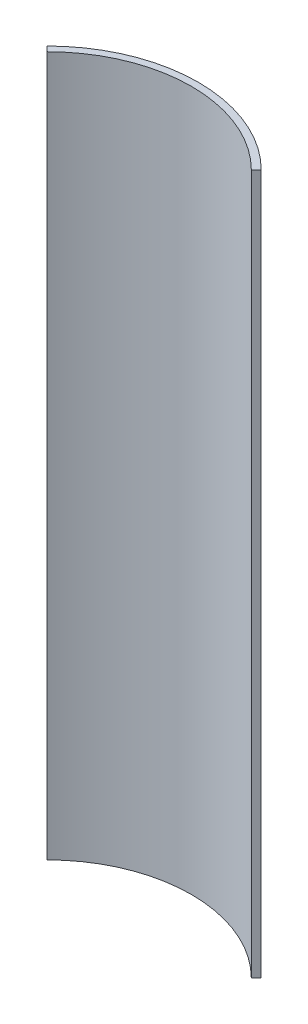
ISO-10303-21;
HEADER;
FILE_DESCRIPTION(('STEP AP214'),'2;1');
FILE_NAME('part.step','',(''),(''),'','','');
FILE_SCHEMA(('AUTOMOTIVE_DESIGN { 1 0 10303 214 1 1 1 1 }'));
ENDSEC;
DATA;
#1=APPLICATION_CONTEXT('core data for automotive mechanical design processes');
#2=APPLICATION_PROTOCOL_DEFINITION('international standard','automotive_design',2000,#1);
#3=PRODUCT_CONTEXT('',#1,'mechanical');
#4=PRODUCT('Part','Part','',(#3));
#5=PRODUCT_RELATED_PRODUCT_CATEGORY('part','',(#4));
#6=PRODUCT_DEFINITION_FORMATION('','',#4);
#7=PRODUCT_DEFINITION_CONTEXT('part definition',#1,'design');
#8=PRODUCT_DEFINITION('design','',#6,#7);
#9=PRODUCT_DEFINITION_SHAPE('','',#8);
#10=(LENGTH_UNIT() NAMED_UNIT(*) SI_UNIT(.MILLI.,.METRE.));
#11=(NAMED_UNIT(*) PLANE_ANGLE_UNIT() SI_UNIT($,.RADIAN.));
#12=(NAMED_UNIT(*) SI_UNIT($,.STERADIAN.) SOLID_ANGLE_UNIT());
#13=UNCERTAINTY_MEASURE_WITH_UNIT(LENGTH_MEASURE(1.E-05),#10,'distance_accuracy_value','');
#14=(GEOMETRIC_REPRESENTATION_CONTEXT(3) GLOBAL_UNCERTAINTY_ASSIGNED_CONTEXT((#13)) GLOBAL_UNIT_ASSIGNED_CONTEXT((#10,
#11,#12)) REPRESENTATION_CONTEXT('',''));
#15=CARTESIAN_POINT('',(0.,0.,0.));
#16=DIRECTION('',(0.,0.,1.));
#17=DIRECTION('',(1.,0.,0.));
#18=AXIS2_PLACEMENT_3D('',#15,#16,#17);
#19=CARTESIAN_POINT('',(0.,0.,0.));
#20=DIRECTION('',(0.,-1.,0.));
#21=DIRECTION('',(0.,0.,-1.));
#22=AXIS2_PLACEMENT_3D('',#19,#20,#21);
#23=CYLINDRICAL_SURFACE('',#22,62.);
#24=CARTESIAN_POINT('',(0.,-150.,0.));
#25=DIRECTION('',(0.,-1.,0.));
#26=DIRECTION('',(0.,0.,-1.));
#27=AXIS2_PLACEMENT_3D('',#24,#25,#26);
#28=CIRCLE('',#27,62.);
#29=CARTESIAN_POINT('',(-43.840620433566,-150.,-43.840620433566));
#30=VERTEX_POINT('',#29);
#31=CARTESIAN_POINT('',(43.840620433566,-150.,-43.840620433566));
#32=VERTEX_POINT('',#31);
#33=EDGE_CURVE('E49',#30,#32,#28,.T.);
#34=ORIENTED_EDGE('',*,*,#33,.T.);
#35=DIRECTION('',(0.,-1.,0.));
#36=VECTOR('',#35,1.);
#37=CARTESIAN_POINT('',(43.840620433566,0.,-43.840620433566));
#38=LINE('',#37,#36);
#39=CARTESIAN_POINT('',(43.840620433566,150.,-43.840620433566));
#40=VERTEX_POINT('',#39);
#41=EDGE_CURVE('E106',#32,#40,#38,.F.);
#42=ORIENTED_EDGE('',*,*,#41,.T.);
#43=CARTESIAN_POINT('',(0.,150.,0.));
#44=DIRECTION('',(0.,-1.,0.));
#45=DIRECTION('',(0.,0.,-1.));
#46=AXIS2_PLACEMENT_3D('',#43,#44,#45);
#47=CIRCLE('',#46,62.);
#48=CARTESIAN_POINT('',(-43.840620433566,150.,-43.840620433566));
#49=VERTEX_POINT('',#48);
#50=EDGE_CURVE('E101',#49,#40,#47,.T.);
#51=ORIENTED_EDGE('',*,*,#50,.F.);
#52=DIRECTION('',(0.,-1.,0.));
#53=VECTOR('',#52,1.);
#54=CARTESIAN_POINT('',(-43.840620433566,0.,-43.840620433566));
#55=LINE('',#54,#53);
#56=EDGE_CURVE('E63',#49,#30,#55,.T.);
#57=ORIENTED_EDGE('',*,*,#56,.T.);
#58=EDGE_LOOP('',(#34,#42,#51,#57));
#59=FACE_BOUND('',#58,.T.);
#60=ADVANCED_FACE('F42',(#59),#23,.F.);
#61=CARTESIAN_POINT('',(62.,-150.,0.));
#62=DIRECTION('',(0.,-1.,0.));
#63=DIRECTION('',(0.,0.,-1.));
#64=AXIS2_PLACEMENT_3D('',#61,#62,#63);
#65=PLANE('',#64);
#66=CARTESIAN_POINT('',(0.,-150.,0.));
#67=DIRECTION('',(0.,-1.,0.));
#68=DIRECTION('',(0.,0.,-1.));
#69=AXIS2_PLACEMENT_3D('',#66,#67,#68);
#70=CIRCLE('',#69,65.);
#71=CARTESIAN_POINT('',(-45.9619407771256,-150.,-45.9619407771256));
#72=VERTEX_POINT('',#71);
#73=CARTESIAN_POINT('',(45.9619407771256,-150.,-45.9619407771256));
#74=VERTEX_POINT('',#73);
#75=EDGE_CURVE('E95',#72,#74,#70,.T.);
#76=ORIENTED_EDGE('',*,*,#75,.T.);
#77=DIRECTION('',(0.707106781186548,0.,-0.707106781186548));
#78=VECTOR('',#77,1.);
#79=CARTESIAN_POINT('',(0.,-150.,0.));
#80=LINE('',#79,#78);
#81=EDGE_CURVE('E88',#32,#74,#80,.T.);
#82=ORIENTED_EDGE('',*,*,#81,.F.);
#83=ORIENTED_EDGE('',*,*,#33,.F.);
#84=DIRECTION('',(0.707106781186548,0.,0.707106781186548));
#85=VECTOR('',#84,1.);
#86=CARTESIAN_POINT('',(0.,-150.,0.));
#87=LINE('',#86,#85);
#88=EDGE_CURVE('E82',#72,#30,#87,.T.);
#89=ORIENTED_EDGE('',*,*,#88,.F.);
#90=EDGE_LOOP('',(#76,#82,#83,#89));
#91=FACE_BOUND('',#90,.T.);
#92=ADVANCED_FACE('F93',(#91),#65,.T.);
#93=CARTESIAN_POINT('',(0.,0.,0.));
#94=DIRECTION('',(0.,-1.,0.));
#95=DIRECTION('',(0.,0.,-1.));
#96=AXIS2_PLACEMENT_3D('',#93,#94,#95);
#97=CYLINDRICAL_SURFACE('',#96,65.);
#98=CARTESIAN_POINT('',(0.,150.,0.));
#99=DIRECTION('',(0.,-1.,0.));
#100=DIRECTION('',(0.,0.,-1.));
#101=AXIS2_PLACEMENT_3D('',#98,#99,#100);
#102=CIRCLE('',#101,65.);
#103=CARTESIAN_POINT('',(-45.9619407771256,150.,-45.9619407771256));
#104=VERTEX_POINT('',#103);
#105=CARTESIAN_POINT('',(45.9619407771256,150.,-45.9619407771256));
#106=VERTEX_POINT('',#105);
#107=EDGE_CURVE('E99',#104,#106,#102,.T.);
#108=ORIENTED_EDGE('',*,*,#107,.T.);
#109=DIRECTION('',(0.,1.,0.));
#110=VECTOR('',#109,1.);
#111=CARTESIAN_POINT('',(45.9619407771256,-150.,-45.9619407771256));
#112=LINE('',#111,#110);
#113=EDGE_CURVE('E56',#74,#106,#112,.T.);
#114=ORIENTED_EDGE('',*,*,#113,.F.);
#115=ORIENTED_EDGE('',*,*,#75,.F.);
#116=DIRECTION('',(0.,1.,0.));
#117=VECTOR('',#116,1.);
#118=CARTESIAN_POINT('',(-45.9619407771256,-150.,-45.9619407771256));
#119=LINE('',#118,#117);
#120=EDGE_CURVE('E79',#72,#104,#119,.T.);
#121=ORIENTED_EDGE('',*,*,#120,.T.);
#122=EDGE_LOOP('',(#108,#114,#115,#121));
#123=FACE_BOUND('',#122,.T.);
#124=ADVANCED_FACE('F98',(#123),#97,.T.);
#125=CARTESIAN_POINT('',(62.,150.,0.));
#126=DIRECTION('',(0.,1.,0.));
#127=DIRECTION('',(0.,0.,1.));
#128=AXIS2_PLACEMENT_3D('',#125,#126,#127);
#129=PLANE('',#128);
#130=ORIENTED_EDGE('',*,*,#50,.T.);
#131=DIRECTION('',(0.707106781186547,0.,-0.707106781186548));
#132=VECTOR('',#131,1.);
#133=CARTESIAN_POINT('',(31.,150.,-31.));
#134=LINE('',#133,#132);
#135=EDGE_CURVE('E12',#40,#106,#134,.T.);
#136=ORIENTED_EDGE('',*,*,#135,.T.);
#137=ORIENTED_EDGE('',*,*,#107,.F.);
#138=DIRECTION('',(0.707106781186548,0.,0.707106781186548));
#139=VECTOR('',#138,1.);
#140=CARTESIAN_POINT('',(0.,150.,0.));
#141=LINE('',#140,#139);
#142=EDGE_CURVE('E83',#104,#49,#141,.T.);
#143=ORIENTED_EDGE('',*,*,#142,.T.);
#144=EDGE_LOOP('',(#130,#136,#137,#143));
#145=FACE_BOUND('',#144,.T.);
#146=ADVANCED_FACE('F116',(#145),#129,.T.);
#147=CARTESIAN_POINT('',(0.,-150.,0.));
#148=DIRECTION('',(-0.707106781186548,0.,0.707106781186547));
#149=DIRECTION('',(0.707106781186547,0.,0.707106781186548));
#150=AXIS2_PLACEMENT_3D('',#147,#148,#149);
#151=PLANE('',#150);
#152=ORIENTED_EDGE('',*,*,#142,.F.);
#153=ORIENTED_EDGE('',*,*,#120,.F.);
#154=ORIENTED_EDGE('',*,*,#88,.T.);
#155=ORIENTED_EDGE('',*,*,#56,.F.);
#156=EDGE_LOOP('',(#152,#153,#154,#155));
#157=FACE_BOUND('',#156,.T.);
#158=ADVANCED_FACE('F81',(#157),#151,.T.);
#159=CARTESIAN_POINT('',(0.,-150.,0.));
#160=DIRECTION('',(0.707106781186548,0.,0.707106781186547));
#161=DIRECTION('',(0.707106781186547,0.,-0.707106781186548));
#162=AXIS2_PLACEMENT_3D('',#159,#160,#161);
#163=PLANE('',#162);
#164=ORIENTED_EDGE('',*,*,#81,.T.);
#165=ORIENTED_EDGE('',*,*,#113,.T.);
#166=ORIENTED_EDGE('',*,*,#135,.F.);
#167=ORIENTED_EDGE('',*,*,#41,.F.);
#168=EDGE_LOOP('',(#164,#165,#166,#167));
#169=FACE_BOUND('',#168,.T.);
#170=ADVANCED_FACE('F112',(#169),#163,.T.);
#171=CLOSED_SHELL('',(#60,#92,#124,#146,#158,#170));
#172=MANIFOLD_SOLID_BREP('B2',#171);
#173=ADVANCED_BREP_SHAPE_REPRESENTATION('',(#18,#172),#14);
#174=SHAPE_DEFINITION_REPRESENTATION(#9,#173);
ENDSEC;
END-ISO-10303-21;
